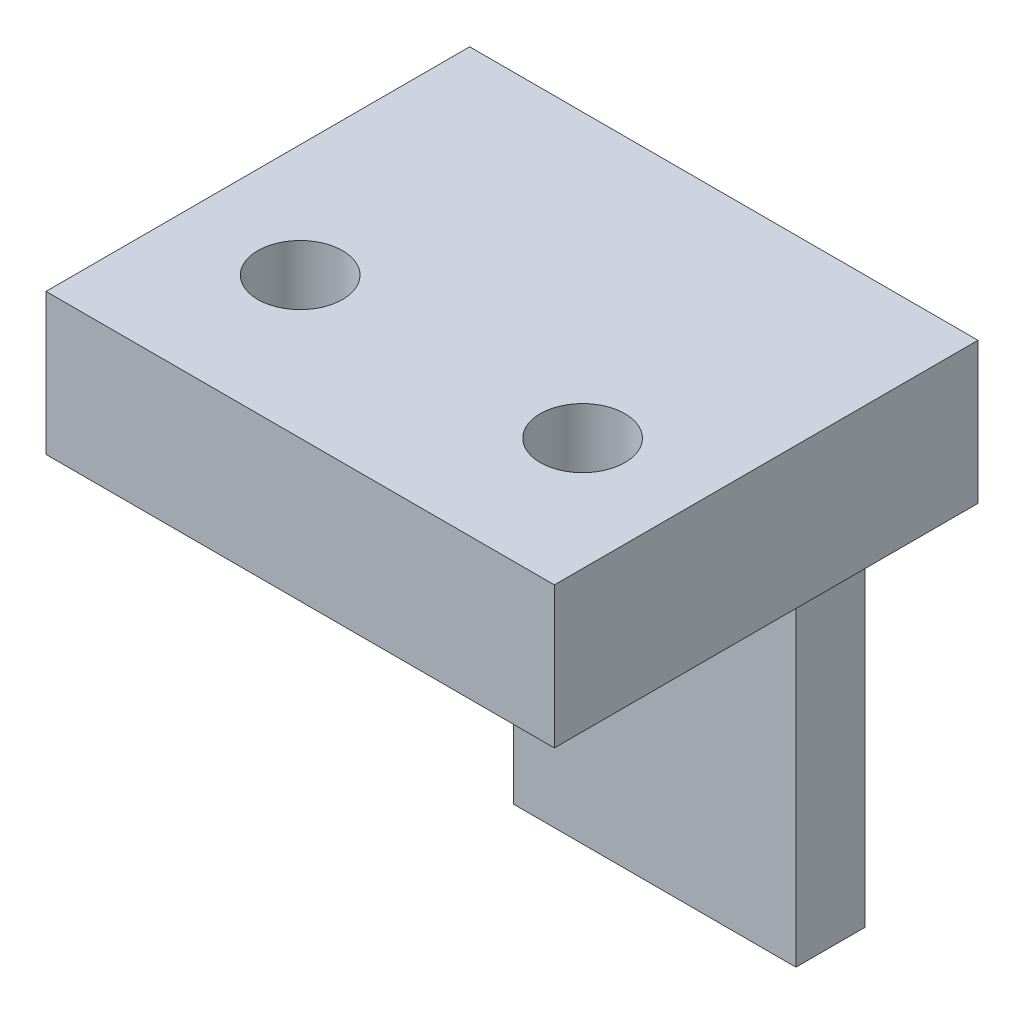
ISO-10303-21;
HEADER;
FILE_DESCRIPTION(('STEP AP214'),'2;1');
FILE_NAME('part.step','',(''),(''),'','','');
FILE_SCHEMA(('AUTOMOTIVE_DESIGN { 1 0 10303 214 1 1 1 1 }'));
ENDSEC;
DATA;
#1=APPLICATION_CONTEXT('core data for automotive mechanical design processes');
#2=APPLICATION_PROTOCOL_DEFINITION('international standard','automotive_design',2000,#1);
#3=PRODUCT_CONTEXT('',#1,'mechanical');
#4=PRODUCT('Part','Part','',(#3));
#5=PRODUCT_RELATED_PRODUCT_CATEGORY('part','',(#4));
#6=PRODUCT_DEFINITION_FORMATION('','',#4);
#7=PRODUCT_DEFINITION_CONTEXT('part definition',#1,'design');
#8=PRODUCT_DEFINITION('design','',#6,#7);
#9=PRODUCT_DEFINITION_SHAPE('','',#8);
#10=(LENGTH_UNIT() NAMED_UNIT(*) SI_UNIT(.MILLI.,.METRE.));
#11=(NAMED_UNIT(*) PLANE_ANGLE_UNIT() SI_UNIT($,.RADIAN.));
#12=(NAMED_UNIT(*) SI_UNIT($,.STERADIAN.) SOLID_ANGLE_UNIT());
#13=UNCERTAINTY_MEASURE_WITH_UNIT(LENGTH_MEASURE(1.E-05),#10,'distance_accuracy_value','');
#14=(GEOMETRIC_REPRESENTATION_CONTEXT(3) GLOBAL_UNCERTAINTY_ASSIGNED_CONTEXT((#13)) GLOBAL_UNIT_ASSIGNED_CONTEXT((#10,
#11,#12)) REPRESENTATION_CONTEXT('',''));
#15=CARTESIAN_POINT('',(0.,0.,0.));
#16=DIRECTION('',(0.,0.,1.));
#17=DIRECTION('',(1.,0.,0.));
#18=AXIS2_PLACEMENT_3D('',#15,#16,#17);
#19=CARTESIAN_POINT('',(0.,0.,0.));
#20=DIRECTION('',(0.,-1.,0.));
#21=DIRECTION('',(0.,0.,-1.));
#22=AXIS2_PLACEMENT_3D('',#19,#20,#21);
#23=PLANE('',#22);
#24=CARTESIAN_POINT('',(4.99999999999999,0.,0.));
#25=DIRECTION('',(0.,1.,0.));
#26=DIRECTION('',(0.,0.,1.));
#27=AXIS2_PLACEMENT_3D('',#24,#25,#26);
#28=CIRCLE('',#27,1.5);
#29=CARTESIAN_POINT('',(4.99999999999999,0.,1.5));
#30=VERTEX_POINT('',#29);
#31=EDGE_CURVE('E156',#30,#30,#28,.T.);
#32=ORIENTED_EDGE('',*,*,#31,.T.);
#33=EDGE_LOOP('',(#32));
#34=FACE_BOUND('',#33,.T.);
#35=CARTESIAN_POINT('',(-5.00000000000001,0.,0.));
#36=DIRECTION('',(0.,1.,0.));
#37=DIRECTION('',(0.,0.,1.));
#38=AXIS2_PLACEMENT_3D('',#35,#36,#37);
#39=CIRCLE('',#38,1.5);
#40=CARTESIAN_POINT('',(-5.00000000000001,0.,1.5));
#41=VERTEX_POINT('',#40);
#42=EDGE_CURVE('E160',#41,#41,#39,.T.);
#43=ORIENTED_EDGE('',*,*,#42,.T.);
#44=EDGE_LOOP('',(#43));
#45=FACE_BOUND('',#44,.T.);
#46=DIRECTION('',(0.,0.,-1.));
#47=VECTOR('',#46,1.);
#48=CARTESIAN_POINT('',(-5.,0.,-7.55269616957775));
#49=LINE('',#48,#47);
#50=CARTESIAN_POINT('',(-5.,0.,-4.55269616957775));
#51=VERTEX_POINT('',#50);
#52=CARTESIAN_POINT('',(-5.,0.,-9.99999999999999));
#53=VERTEX_POINT('',#52);
#54=EDGE_CURVE('E37',#51,#53,#49,.T.);
#55=ORIENTED_EDGE('',*,*,#54,.F.);
#56=DIRECTION('',(1.,0.,0.));
#57=VECTOR('',#56,1.);
#58=CARTESIAN_POINT('',(-5.,0.,-4.55269616957773));
#59=LINE('',#58,#57);
#60=CARTESIAN_POINT('',(5.,0.,-4.55269616957773));
#61=VERTEX_POINT('',#60);
#62=EDGE_CURVE('E251',#51,#61,#59,.T.);
#63=ORIENTED_EDGE('',*,*,#62,.T.);
#64=DIRECTION('',(0.,0.,1.));
#65=VECTOR('',#64,1.);
#66=CARTESIAN_POINT('',(5.,0.,-7.55269616957775));
#67=LINE('',#66,#65);
#68=CARTESIAN_POINT('',(5.,0.,-10.));
#69=VERTEX_POINT('',#68);
#70=EDGE_CURVE('E58',#69,#61,#67,.T.);
#71=ORIENTED_EDGE('',*,*,#70,.F.);
#72=DIRECTION('',(-1.,0.,0.));
#73=VECTOR('',#72,1.);
#74=CARTESIAN_POINT('',(9.,0.,-10.));
#75=LINE('',#74,#73);
#76=CARTESIAN_POINT('',(9.,0.,-10.));
#77=VERTEX_POINT('',#76);
#78=EDGE_CURVE('E145',#77,#69,#75,.T.);
#79=ORIENTED_EDGE('',*,*,#78,.F.);
#80=DIRECTION('',(0.,0.,-1.));
#81=VECTOR('',#80,1.);
#82=CARTESIAN_POINT('',(9.,0.,-5.));
#83=LINE('',#82,#81);
#84=CARTESIAN_POINT('',(9.,0.,5.));
#85=VERTEX_POINT('',#84);
#86=EDGE_CURVE('E173',#85,#77,#83,.T.);
#87=ORIENTED_EDGE('',*,*,#86,.F.);
#88=DIRECTION('',(1.,0.,0.));
#89=VECTOR('',#88,1.);
#90=CARTESIAN_POINT('',(9.,0.,5.));
#91=LINE('',#90,#89);
#92=CARTESIAN_POINT('',(-9.,0.,5.));
#93=VERTEX_POINT('',#92);
#94=EDGE_CURVE('E179',#93,#85,#91,.T.);
#95=ORIENTED_EDGE('',*,*,#94,.F.);
#96=DIRECTION('',(0.,0.,1.));
#97=VECTOR('',#96,1.);
#98=CARTESIAN_POINT('',(-9.,0.,-5.));
#99=LINE('',#98,#97);
#100=CARTESIAN_POINT('',(-9.,0.,-9.99999999999999));
#101=VERTEX_POINT('',#100);
#102=EDGE_CURVE('E166',#101,#93,#99,.T.);
#103=ORIENTED_EDGE('',*,*,#102,.F.);
#104=EDGE_CURVE('E132',#53,#101,#75,.T.);
#105=ORIENTED_EDGE('',*,*,#104,.F.);
#106=EDGE_LOOP('',(#55,#63,#71,#79,#87,#95,#103,#105));
#107=FACE_BOUND('',#106,.T.);
#108=ADVANCED_FACE('F33',(#34,#45,#107),#23,.T.);
#109=CARTESIAN_POINT('',(0.,5.,0.));
#110=DIRECTION('',(0.,-1.,0.));
#111=DIRECTION('',(0.,0.,-1.));
#112=AXIS2_PLACEMENT_3D('',#109,#110,#111);
#113=PLANE('',#112);
#114=CARTESIAN_POINT('',(-5.00000000000001,5.,0.));
#115=DIRECTION('',(0.,1.,0.));
#116=DIRECTION('',(0.,0.,1.));
#117=AXIS2_PLACEMENT_3D('',#114,#115,#116);
#118=CIRCLE('',#117,1.5);
#119=CARTESIAN_POINT('',(-5.00000000000001,5.,1.5));
#120=VERTEX_POINT('',#119);
#121=EDGE_CURVE('E163',#120,#120,#118,.T.);
#122=ORIENTED_EDGE('',*,*,#121,.F.);
#123=EDGE_LOOP('',(#122));
#124=FACE_BOUND('',#123,.T.);
#125=DIRECTION('',(0.,0.,1.));
#126=VECTOR('',#125,1.);
#127=CARTESIAN_POINT('',(-9.,5.,-5.));
#128=LINE('',#127,#126);
#129=CARTESIAN_POINT('',(-9.,5.,-9.99999999999999));
#130=VERTEX_POINT('',#129);
#131=CARTESIAN_POINT('',(-9.,5.,5.));
#132=VERTEX_POINT('',#131);
#133=EDGE_CURVE('E169',#130,#132,#128,.T.);
#134=ORIENTED_EDGE('',*,*,#133,.T.);
#135=DIRECTION('',(1.,0.,0.));
#136=VECTOR('',#135,1.);
#137=CARTESIAN_POINT('',(9.,5.,5.));
#138=LINE('',#137,#136);
#139=CARTESIAN_POINT('',(9.,5.,5.));
#140=VERTEX_POINT('',#139);
#141=EDGE_CURVE('E172',#132,#140,#138,.T.);
#142=ORIENTED_EDGE('',*,*,#141,.T.);
#143=DIRECTION('',(0.,0.,-1.));
#144=VECTOR('',#143,1.);
#145=CARTESIAN_POINT('',(9.,5.,-5.));
#146=LINE('',#145,#144);
#147=CARTESIAN_POINT('',(9.,5.,-10.));
#148=VERTEX_POINT('',#147);
#149=EDGE_CURVE('E175',#140,#148,#146,.T.);
#150=ORIENTED_EDGE('',*,*,#149,.T.);
#151=DIRECTION('',(1.,0.,0.));
#152=VECTOR('',#151,1.);
#153=CARTESIAN_POINT('',(9.,5.,-10.));
#154=LINE('',#153,#152);
#155=EDGE_CURVE('E153',#130,#148,#154,.T.);
#156=ORIENTED_EDGE('',*,*,#155,.F.);
#157=EDGE_LOOP('',(#134,#142,#150,#156));
#158=FACE_BOUND('',#157,.T.);
#159=CARTESIAN_POINT('',(4.99999999999999,5.,0.));
#160=DIRECTION('',(0.,1.,0.));
#161=DIRECTION('',(0.,0.,1.));
#162=AXIS2_PLACEMENT_3D('',#159,#160,#161);
#163=CIRCLE('',#162,1.5);
#164=CARTESIAN_POINT('',(4.99999999999999,5.,1.5));
#165=VERTEX_POINT('',#164);
#166=EDGE_CURVE('E157',#165,#165,#163,.T.);
#167=ORIENTED_EDGE('',*,*,#166,.F.);
#168=EDGE_LOOP('',(#167));
#169=FACE_BOUND('',#168,.T.);
#170=ADVANCED_FACE('F195',(#124,#158,#169),#113,.F.);
#171=CARTESIAN_POINT('',(-9.,5.,-5.));
#172=DIRECTION('',(1.,0.,0.));
#173=DIRECTION('',(0.,0.,-1.));
#174=AXIS2_PLACEMENT_3D('',#171,#172,#173);
#175=PLANE('',#174);
#176=ORIENTED_EDGE('',*,*,#102,.T.);
#177=DIRECTION('',(0.,-1.,0.));
#178=VECTOR('',#177,1.);
#179=CARTESIAN_POINT('',(-9.,5.,5.));
#180=LINE('',#179,#178);
#181=EDGE_CURVE('E11',#132,#93,#180,.T.);
#182=ORIENTED_EDGE('',*,*,#181,.F.);
#183=ORIENTED_EDGE('',*,*,#133,.F.);
#184=DIRECTION('',(0.,1.,0.));
#185=VECTOR('',#184,1.);
#186=CARTESIAN_POINT('',(-9.,5.,-9.99999999999999));
#187=LINE('',#186,#185);
#188=EDGE_CURVE('E149',#101,#130,#187,.T.);
#189=ORIENTED_EDGE('',*,*,#188,.F.);
#190=EDGE_LOOP('',(#176,#182,#183,#189));
#191=FACE_BOUND('',#190,.T.);
#192=ADVANCED_FACE('F35',(#191),#175,.F.);
#193=CARTESIAN_POINT('',(9.,5.,5.));
#194=DIRECTION('',(0.,0.,-1.));
#195=DIRECTION('',(-1.,0.,0.));
#196=AXIS2_PLACEMENT_3D('',#193,#194,#195);
#197=PLANE('',#196);
#198=ORIENTED_EDGE('',*,*,#94,.T.);
#199=DIRECTION('',(0.,-1.,0.));
#200=VECTOR('',#199,1.);
#201=CARTESIAN_POINT('',(9.,5.,5.));
#202=LINE('',#201,#200);
#203=EDGE_CURVE('E43',#140,#85,#202,.T.);
#204=ORIENTED_EDGE('',*,*,#203,.F.);
#205=ORIENTED_EDGE('',*,*,#141,.F.);
#206=ORIENTED_EDGE('',*,*,#181,.T.);
#207=EDGE_LOOP('',(#198,#204,#205,#206));
#208=FACE_BOUND('',#207,.T.);
#209=ADVANCED_FACE('F198',(#208),#197,.F.);
#210=CARTESIAN_POINT('',(9.,5.,-5.));
#211=DIRECTION('',(-1.,0.,0.));
#212=DIRECTION('',(0.,0.,1.));
#213=AXIS2_PLACEMENT_3D('',#210,#211,#212);
#214=PLANE('',#213);
#215=ORIENTED_EDGE('',*,*,#86,.T.);
#216=DIRECTION('',(0.,-1.,0.));
#217=VECTOR('',#216,1.);
#218=CARTESIAN_POINT('',(9.,5.,-10.));
#219=LINE('',#218,#217);
#220=EDGE_CURVE('E130',#148,#77,#219,.T.);
#221=ORIENTED_EDGE('',*,*,#220,.F.);
#222=ORIENTED_EDGE('',*,*,#149,.F.);
#223=ORIENTED_EDGE('',*,*,#203,.T.);
#224=EDGE_LOOP('',(#215,#221,#222,#223));
#225=FACE_BOUND('',#224,.T.);
#226=ADVANCED_FACE('F187',(#225),#214,.F.);
#227=CARTESIAN_POINT('',(-5.00000000000001,5.,0.));
#228=DIRECTION('',(0.,-1.,0.));
#229=DIRECTION('',(0.,0.,-1.));
#230=AXIS2_PLACEMENT_3D('',#227,#228,#229);
#231=CYLINDRICAL_SURFACE('',#230,1.5);
#232=ORIENTED_EDGE('',*,*,#121,.T.);
#233=EDGE_LOOP('',(#232));
#234=FACE_BOUND('',#233,.T.);
#235=ORIENTED_EDGE('',*,*,#42,.F.);
#236=EDGE_LOOP('',(#235));
#237=FACE_BOUND('',#236,.T.);
#238=ADVANCED_FACE('F216',(#234,#237),#231,.F.);
#239=CARTESIAN_POINT('',(4.99999999999999,5.,0.));
#240=DIRECTION('',(0.,-1.,0.));
#241=DIRECTION('',(0.,0.,-1.));
#242=AXIS2_PLACEMENT_3D('',#239,#240,#241);
#243=CYLINDRICAL_SURFACE('',#242,1.5);
#244=ORIENTED_EDGE('',*,*,#166,.T.);
#245=EDGE_LOOP('',(#244));
#246=FACE_BOUND('',#245,.T.);
#247=ORIENTED_EDGE('',*,*,#31,.F.);
#248=EDGE_LOOP('',(#247));
#249=FACE_BOUND('',#248,.T.);
#250=ADVANCED_FACE('F220',(#246,#249),#243,.F.);
#251=CARTESIAN_POINT('',(0.,0.,-10.));
#252=DIRECTION('',(0.,0.,-1.));
#253=DIRECTION('',(-1.,0.,0.));
#254=AXIS2_PLACEMENT_3D('',#251,#252,#253);
#255=PLANE('',#254);
#256=ORIENTED_EDGE('',*,*,#220,.T.);
#257=ORIENTED_EDGE('',*,*,#78,.T.);
#258=DIRECTION('',(0.,1.,0.));
#259=VECTOR('',#258,1.);
#260=CARTESIAN_POINT('',(5.,-15.,-9.99999999999999));
#261=LINE('',#260,#259);
#262=CARTESIAN_POINT('',(5.,-15.,-9.99999999999999));
#263=VERTEX_POINT('',#262);
#264=EDGE_CURVE('E114',#263,#69,#261,.T.);
#265=ORIENTED_EDGE('',*,*,#264,.F.);
#266=DIRECTION('',(1.,0.,0.));
#267=VECTOR('',#266,1.);
#268=CARTESIAN_POINT('',(5.,-15.,-9.99999999999999));
#269=LINE('',#268,#267);
#270=CARTESIAN_POINT('',(-5.,-15.,-9.99999999999999));
#271=VERTEX_POINT('',#270);
#272=EDGE_CURVE('E107',#271,#263,#269,.T.);
#273=ORIENTED_EDGE('',*,*,#272,.F.);
#274=DIRECTION('',(0.,1.,0.));
#275=VECTOR('',#274,1.);
#276=CARTESIAN_POINT('',(-5.,-15.,-9.99999999999999));
#277=LINE('',#276,#275);
#278=EDGE_CURVE('E112',#271,#53,#277,.T.);
#279=ORIENTED_EDGE('',*,*,#278,.T.);
#280=ORIENTED_EDGE('',*,*,#104,.T.);
#281=ORIENTED_EDGE('',*,*,#188,.T.);
#282=ORIENTED_EDGE('',*,*,#155,.T.);
#283=EDGE_LOOP('',(#256,#257,#265,#273,#279,#280,#281,#282));
#284=FACE_BOUND('',#283,.T.);
#285=ADVANCED_FACE('F110',(#284),#255,.T.);
#286=CARTESIAN_POINT('',(-5.,-15.,-7.55269616957775));
#287=DIRECTION('',(1.,0.,0.));
#288=DIRECTION('',(0.,0.,-1.));
#289=AXIS2_PLACEMENT_3D('',#286,#287,#288);
#290=PLANE('',#289);
#291=ORIENTED_EDGE('',*,*,#54,.T.);
#292=ORIENTED_EDGE('',*,*,#278,.F.);
#293=DIRECTION('',(0.,0.,-1.));
#294=VECTOR('',#293,1.);
#295=CARTESIAN_POINT('',(-5.,-15.,-7.55269616957775));
#296=LINE('',#295,#294);
#297=CARTESIAN_POINT('',(-5.,-15.,-7.55269616957775));
#298=VERTEX_POINT('',#297);
#299=EDGE_CURVE('E118',#298,#271,#296,.T.);
#300=ORIENTED_EDGE('',*,*,#299,.F.);
#301=DIRECTION('',(0.,1.,0.));
#302=VECTOR('',#301,1.);
#303=CARTESIAN_POINT('',(-5.,-15.,-7.55269616957775));
#304=LINE('',#303,#302);
#305=CARTESIAN_POINT('',(-5.,-3.00000000000002,-7.55269616957775));
#306=VERTEX_POINT('',#305);
#307=EDGE_CURVE('E261',#298,#306,#304,.T.);
#308=ORIENTED_EDGE('',*,*,#307,.T.);
#309=CARTESIAN_POINT('',(-5.,-3.,-4.55269616957775));
#310=DIRECTION('',(-1.,0.,0.));
#311=DIRECTION('',(0.,0.,-1.));
#312=AXIS2_PLACEMENT_3D('',#309,#310,#311);
#313=CIRCLE('',#312,3.);
#314=EDGE_CURVE('E254',#51,#306,#313,.T.);
#315=ORIENTED_EDGE('',*,*,#314,.F.);
#316=EDGE_LOOP('',(#291,#292,#300,#308,#315));
#317=FACE_BOUND('',#316,.T.);
#318=ADVANCED_FACE('F128',(#317),#290,.F.);
#319=CARTESIAN_POINT('',(5.,-15.,-7.55269616957775));
#320=DIRECTION('',(-1.,0.,0.));
#321=DIRECTION('',(0.,0.,1.));
#322=AXIS2_PLACEMENT_3D('',#319,#320,#321);
#323=PLANE('',#322);
#324=ORIENTED_EDGE('',*,*,#70,.T.);
#325=CARTESIAN_POINT('',(5.,-3.,-4.55269616957775));
#326=DIRECTION('',(-1.,0.,0.));
#327=DIRECTION('',(0.,0.,-1.));
#328=AXIS2_PLACEMENT_3D('',#325,#326,#327);
#329=CIRCLE('',#328,3.);
#330=CARTESIAN_POINT('',(5.,-3.00000000000002,-7.55269616957775));
#331=VERTEX_POINT('',#330);
#332=EDGE_CURVE('E249',#61,#331,#329,.T.);
#333=ORIENTED_EDGE('',*,*,#332,.T.);
#334=DIRECTION('',(0.,1.,0.));
#335=VECTOR('',#334,1.);
#336=CARTESIAN_POINT('',(5.,-15.,-7.55269616957775));
#337=LINE('',#336,#335);
#338=CARTESIAN_POINT('',(5.,-15.,-7.55269616957775));
#339=VERTEX_POINT('',#338);
#340=EDGE_CURVE('E134',#339,#331,#337,.T.);
#341=ORIENTED_EDGE('',*,*,#340,.F.);
#342=DIRECTION('',(0.,0.,1.));
#343=VECTOR('',#342,1.);
#344=CARTESIAN_POINT('',(5.,-15.,-7.55269616957775));
#345=LINE('',#344,#343);
#346=EDGE_CURVE('E117',#263,#339,#345,.T.);
#347=ORIENTED_EDGE('',*,*,#346,.F.);
#348=ORIENTED_EDGE('',*,*,#264,.T.);
#349=EDGE_LOOP('',(#324,#333,#341,#347,#348));
#350=FACE_BOUND('',#349,.T.);
#351=ADVANCED_FACE('F233',(#350),#323,.F.);
#352=CARTESIAN_POINT('',(5.,-15.,-7.55269616957775));
#353=DIRECTION('',(0.,0.,-1.));
#354=DIRECTION('',(-1.,0.,0.));
#355=AXIS2_PLACEMENT_3D('',#352,#353,#354);
#356=PLANE('',#355);
#357=ORIENTED_EDGE('',*,*,#340,.T.);
#358=DIRECTION('',(1.,0.,0.));
#359=VECTOR('',#358,1.);
#360=CARTESIAN_POINT('',(-5.,-3.00000000000002,-7.55269616957775));
#361=LINE('',#360,#359);
#362=EDGE_CURVE('E252',#306,#331,#361,.T.);
#363=ORIENTED_EDGE('',*,*,#362,.F.);
#364=ORIENTED_EDGE('',*,*,#307,.F.);
#365=DIRECTION('',(-1.,0.,0.));
#366=VECTOR('',#365,1.);
#367=CARTESIAN_POINT('',(5.,-15.,-7.55269616957775));
#368=LINE('',#367,#366);
#369=EDGE_CURVE('E123',#339,#298,#368,.T.);
#370=ORIENTED_EDGE('',*,*,#369,.F.);
#371=EDGE_LOOP('',(#357,#363,#364,#370));
#372=FACE_BOUND('',#371,.T.);
#373=ADVANCED_FACE('F236',(#372),#356,.F.);
#374=CARTESIAN_POINT('',(0.,-15.,0.));
#375=DIRECTION('',(0.,1.,0.));
#376=DIRECTION('',(0.,0.,1.));
#377=AXIS2_PLACEMENT_3D('',#374,#375,#376);
#378=PLANE('',#377);
#379=ORIENTED_EDGE('',*,*,#299,.T.);
#380=ORIENTED_EDGE('',*,*,#272,.T.);
#381=ORIENTED_EDGE('',*,*,#346,.T.);
#382=ORIENTED_EDGE('',*,*,#369,.T.);
#383=EDGE_LOOP('',(#379,#380,#381,#382));
#384=FACE_BOUND('',#383,.T.);
#385=ADVANCED_FACE('F121',(#384),#378,.F.);
#386=CARTESIAN_POINT('',(-5.,-3.,-4.55269616957775));
#387=DIRECTION('',(1.,0.,0.));
#388=DIRECTION('',(0.,0.,-1.));
#389=AXIS2_PLACEMENT_3D('',#386,#387,#388);
#390=CYLINDRICAL_SURFACE('',#389,3.);
#391=ORIENTED_EDGE('',*,*,#332,.F.);
#392=ORIENTED_EDGE('',*,*,#62,.F.);
#393=ORIENTED_EDGE('',*,*,#314,.T.);
#394=ORIENTED_EDGE('',*,*,#362,.T.);
#395=EDGE_LOOP('',(#391,#392,#393,#394));
#396=FACE_BOUND('',#395,.T.);
#397=ADVANCED_FACE('F242',(#396),#390,.F.);
#398=CLOSED_SHELL('',(#108,#170,#192,#209,#226,#238,#250,#285,#318,#351,#373,#385,#397));
#399=MANIFOLD_SOLID_BREP('B2',#398);
#400=ADVANCED_BREP_SHAPE_REPRESENTATION('',(#18,#399),#14);
#401=SHAPE_DEFINITION_REPRESENTATION(#9,#400);
ENDSEC;
END-ISO-10303-21;
